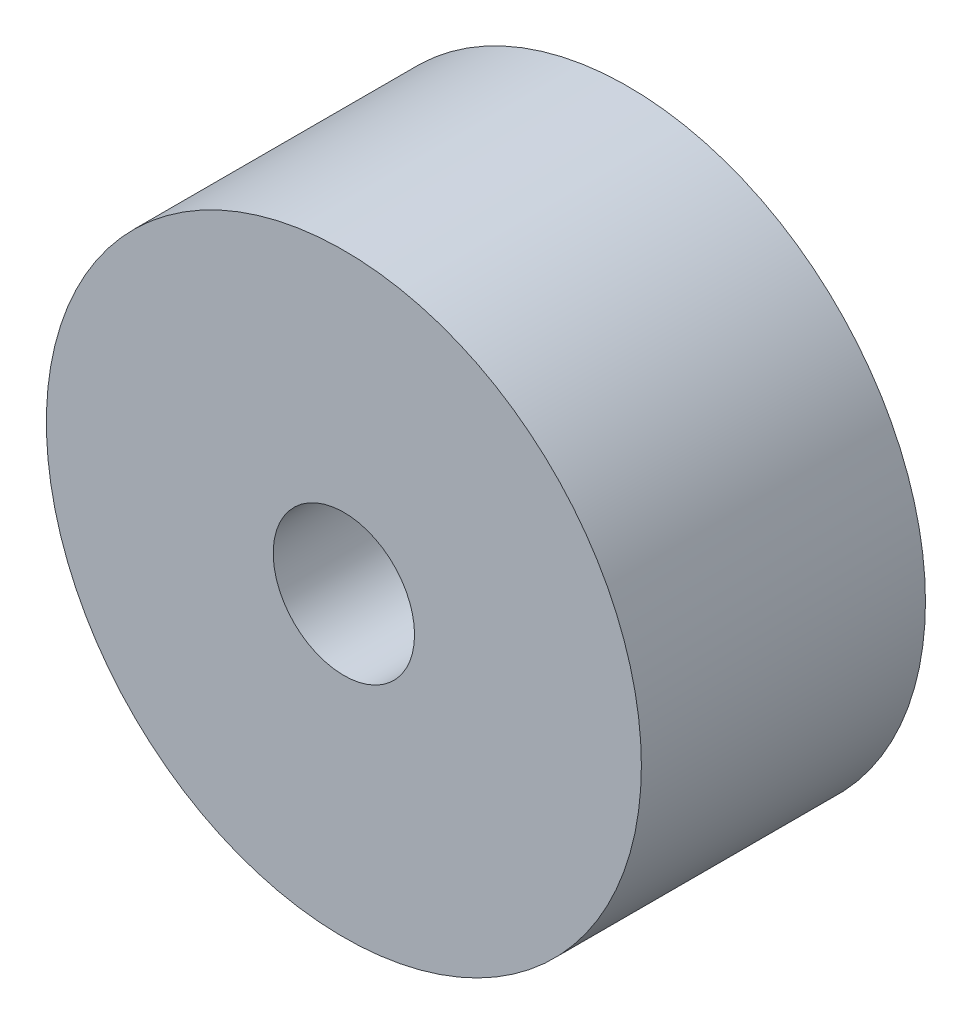
ISO-10303-21;
HEADER;
FILE_DESCRIPTION(('STEP AP214'),'2;1');
FILE_NAME('part.step','',(''),(''),'','','');
FILE_SCHEMA(('AUTOMOTIVE_DESIGN { 1 0 10303 214 1 1 1 1 }'));
ENDSEC;
DATA;
#1=APPLICATION_CONTEXT('core data for automotive mechanical design processes');
#2=APPLICATION_PROTOCOL_DEFINITION('international standard','automotive_design',2000,#1);
#3=PRODUCT_CONTEXT('',#1,'mechanical');
#4=PRODUCT('Part','Part','',(#3));
#5=PRODUCT_RELATED_PRODUCT_CATEGORY('part','',(#4));
#6=PRODUCT_DEFINITION_FORMATION('','',#4);
#7=PRODUCT_DEFINITION_CONTEXT('part definition',#1,'design');
#8=PRODUCT_DEFINITION('design','',#6,#7);
#9=PRODUCT_DEFINITION_SHAPE('','',#8);
#10=(LENGTH_UNIT() NAMED_UNIT(*) SI_UNIT(.MILLI.,.METRE.));
#11=(NAMED_UNIT(*) PLANE_ANGLE_UNIT() SI_UNIT($,.RADIAN.));
#12=(NAMED_UNIT(*) SI_UNIT($,.STERADIAN.) SOLID_ANGLE_UNIT());
#13=UNCERTAINTY_MEASURE_WITH_UNIT(LENGTH_MEASURE(1.E-05),#10,'distance_accuracy_value','');
#14=(GEOMETRIC_REPRESENTATION_CONTEXT(3) GLOBAL_UNCERTAINTY_ASSIGNED_CONTEXT((#13)) GLOBAL_UNIT_ASSIGNED_CONTEXT((#10,
#11,#12)) REPRESENTATION_CONTEXT('',''));
#15=CARTESIAN_POINT('',(0.,0.,0.));
#16=DIRECTION('',(0.,0.,1.));
#17=DIRECTION('',(1.,0.,0.));
#18=AXIS2_PLACEMENT_3D('',#15,#16,#17);
#19=CARTESIAN_POINT('',(0.,0.,10.05));
#20=DIRECTION('',(0.,0.,1.));
#21=DIRECTION('',(1.,0.,0.));
#22=AXIS2_PLACEMENT_3D('',#19,#20,#21);
#23=PLANE('',#22);
#24=CARTESIAN_POINT('',(0.,0.,10.05));
#25=DIRECTION('',(0.,0.,1.));
#26=DIRECTION('',(1.,0.,0.));
#27=AXIS2_PLACEMENT_3D('',#24,#25,#26);
#28=CIRCLE('',#27,21.05);
#29=CARTESIAN_POINT('',(21.05,0.,10.05));
#30=VERTEX_POINT('',#29);
#31=EDGE_CURVE('E10',#30,#30,#28,.T.);
#32=ORIENTED_EDGE('',*,*,#31,.T.);
#33=EDGE_LOOP('',(#32));
#34=FACE_BOUND('',#33,.T.);
#35=CARTESIAN_POINT('',(0.,0.,10.05));
#36=DIRECTION('',(0.,0.,1.));
#37=DIRECTION('',(1.,0.,0.));
#38=AXIS2_PLACEMENT_3D('',#35,#36,#37);
#39=CIRCLE('',#38,5.);
#40=CARTESIAN_POINT('',(5.,0.,10.05));
#41=VERTEX_POINT('',#40);
#42=EDGE_CURVE('E48',#41,#41,#39,.T.);
#43=ORIENTED_EDGE('',*,*,#42,.F.);
#44=EDGE_LOOP('',(#43));
#45=FACE_BOUND('',#44,.T.);
#46=ADVANCED_FACE('F37',(#34,#45),#23,.T.);
#47=CARTESIAN_POINT('',(0.,0.,-10.05));
#48=DIRECTION('',(0.,0.,1.));
#49=DIRECTION('',(1.,0.,0.));
#50=AXIS2_PLACEMENT_3D('',#47,#48,#49);
#51=PLANE('',#50);
#52=CARTESIAN_POINT('',(0.,0.,-10.05));
#53=DIRECTION('',(0.,0.,1.));
#54=DIRECTION('',(1.,0.,0.));
#55=AXIS2_PLACEMENT_3D('',#52,#53,#54);
#56=CIRCLE('',#55,21.05);
#57=CARTESIAN_POINT('',(21.05,0.,-10.05));
#58=VERTEX_POINT('',#57);
#59=EDGE_CURVE('E41',#58,#58,#56,.T.);
#60=ORIENTED_EDGE('',*,*,#59,.F.);
#61=EDGE_LOOP('',(#60));
#62=FACE_BOUND('',#61,.T.);
#63=CARTESIAN_POINT('',(0.,0.,-10.05));
#64=DIRECTION('',(0.,0.,1.));
#65=DIRECTION('',(1.,0.,0.));
#66=AXIS2_PLACEMENT_3D('',#63,#64,#65);
#67=CIRCLE('',#66,5.);
#68=CARTESIAN_POINT('',(5.,0.,-10.05));
#69=VERTEX_POINT('',#68);
#70=EDGE_CURVE('E50',#69,#69,#67,.T.);
#71=ORIENTED_EDGE('',*,*,#70,.T.);
#72=EDGE_LOOP('',(#71));
#73=FACE_BOUND('',#72,.T.);
#74=ADVANCED_FACE('F60',(#62,#73),#51,.F.);
#75=CARTESIAN_POINT('',(0.,0.,10.05));
#76=DIRECTION('',(0.,0.,-1.));
#77=DIRECTION('',(-1.,0.,0.));
#78=AXIS2_PLACEMENT_3D('',#75,#76,#77);
#79=CYLINDRICAL_SURFACE('',#78,21.05);
#80=ORIENTED_EDGE('',*,*,#31,.F.);
#81=EDGE_LOOP('',(#80));
#82=FACE_BOUND('',#81,.T.);
#83=ORIENTED_EDGE('',*,*,#59,.T.);
#84=EDGE_LOOP('',(#83));
#85=FACE_BOUND('',#84,.T.);
#86=ADVANCED_FACE('F39',(#82,#85),#79,.T.);
#87=CARTESIAN_POINT('',(0.,0.,10.05));
#88=DIRECTION('',(0.,0.,-1.));
#89=DIRECTION('',(-1.,0.,0.));
#90=AXIS2_PLACEMENT_3D('',#87,#88,#89);
#91=CYLINDRICAL_SURFACE('',#90,5.);
#92=ORIENTED_EDGE('',*,*,#42,.T.);
#93=EDGE_LOOP('',(#92));
#94=FACE_BOUND('',#93,.T.);
#95=ORIENTED_EDGE('',*,*,#70,.F.);
#96=EDGE_LOOP('',(#95));
#97=FACE_BOUND('',#96,.T.);
#98=ADVANCED_FACE('F56',(#94,#97),#91,.F.);
#99=CLOSED_SHELL('',(#46,#74,#86,#98));
#100=MANIFOLD_SOLID_BREP('B2',#99);
#101=ADVANCED_BREP_SHAPE_REPRESENTATION('',(#18,#100),#14);
#102=SHAPE_DEFINITION_REPRESENTATION(#9,#101);
ENDSEC;
END-ISO-10303-21;
